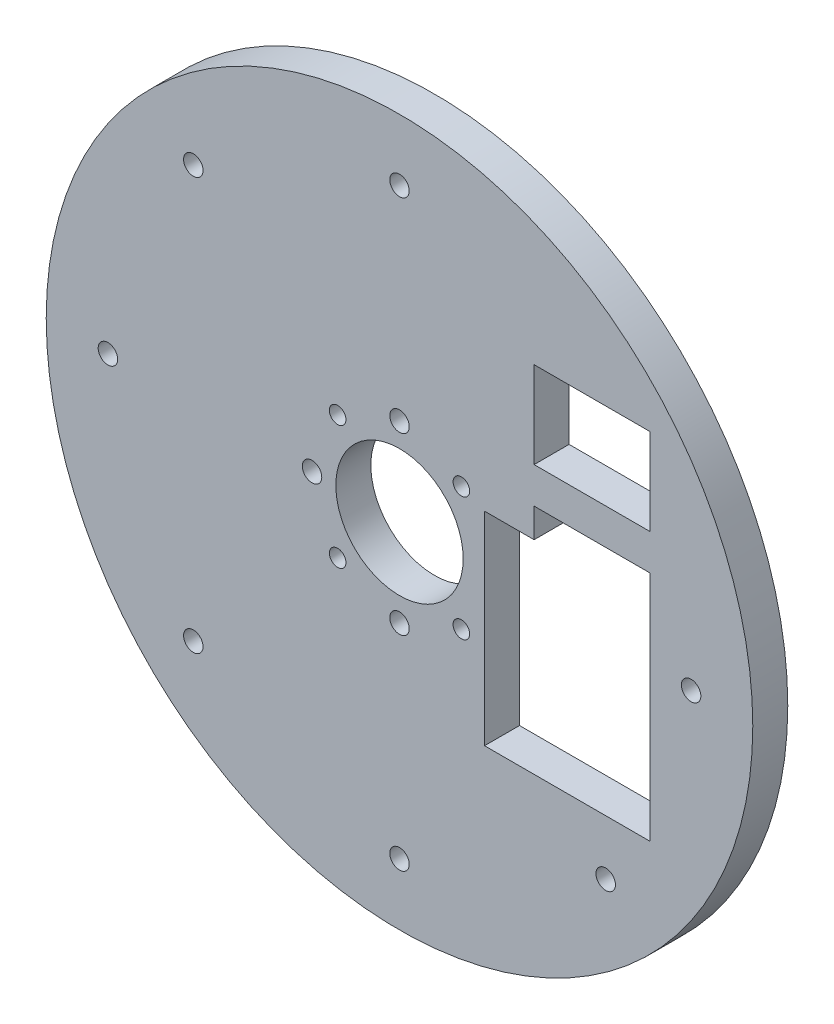
ISO-10303-21;
HEADER;
FILE_DESCRIPTION(('STEP AP214'),'2;1');
FILE_NAME('part.step','',(''),(''),'','','');
FILE_SCHEMA(('AUTOMOTIVE_DESIGN { 1 0 10303 214 1 1 1 1 }'));
ENDSEC;
DATA;
#1=APPLICATION_CONTEXT('core data for automotive mechanical design processes');
#2=APPLICATION_PROTOCOL_DEFINITION('international standard','automotive_design',2000,#1);
#3=PRODUCT_CONTEXT('',#1,'mechanical');
#4=PRODUCT('Part','Part','',(#3));
#5=PRODUCT_RELATED_PRODUCT_CATEGORY('part','',(#4));
#6=PRODUCT_DEFINITION_FORMATION('','',#4);
#7=PRODUCT_DEFINITION_CONTEXT('part definition',#1,'design');
#8=PRODUCT_DEFINITION('design','',#6,#7);
#9=PRODUCT_DEFINITION_SHAPE('','',#8);
#10=(LENGTH_UNIT() NAMED_UNIT(*) SI_UNIT(.MILLI.,.METRE.));
#11=(NAMED_UNIT(*) PLANE_ANGLE_UNIT() SI_UNIT($,.RADIAN.));
#12=(NAMED_UNIT(*) SI_UNIT($,.STERADIAN.) SOLID_ANGLE_UNIT());
#13=UNCERTAINTY_MEASURE_WITH_UNIT(LENGTH_MEASURE(1.E-05),#10,'distance_accuracy_value','');
#14=(GEOMETRIC_REPRESENTATION_CONTEXT(3) GLOBAL_UNCERTAINTY_ASSIGNED_CONTEXT((#13)) GLOBAL_UNIT_ASSIGNED_CONTEXT((#10,
#11,#12)) REPRESENTATION_CONTEXT('',''));
#15=CARTESIAN_POINT('',(0.,0.,0.));
#16=DIRECTION('',(0.,0.,1.));
#17=DIRECTION('',(1.,0.,0.));
#18=AXIS2_PLACEMENT_3D('',#15,#16,#17);
#19=CARTESIAN_POINT('',(0.,0.,6.));
#20=DIRECTION('',(0.,0.,1.));
#21=DIRECTION('',(1.,0.,0.));
#22=AXIS2_PLACEMENT_3D('',#19,#20,#21);
#23=PLANE('',#22);
#24=DIRECTION('',(0.,-1.,0.));
#25=VECTOR('',#24,1.);
#26=CARTESIAN_POINT('',(23.08,0.,6.));
#27=LINE('',#26,#25);
#28=CARTESIAN_POINT('',(23.08,13.92,6.));
#29=VERTEX_POINT('',#28);
#30=CARTESIAN_POINT('',(23.08,8.92,6.));
#31=VERTEX_POINT('',#30);
#32=EDGE_CURVE('E52',#29,#31,#27,.T.);
#33=ORIENTED_EDGE('',*,*,#32,.F.);
#34=DIRECTION('',(-1.,0.,0.));
#35=VECTOR('',#34,1.);
#36=CARTESIAN_POINT('',(0.,13.92,6.));
#37=LINE('',#36,#35);
#38=CARTESIAN_POINT('',(42.92,13.92,6.));
#39=VERTEX_POINT('',#38);
#40=EDGE_CURVE('E166',#39,#29,#37,.T.);
#41=ORIENTED_EDGE('',*,*,#40,.F.);
#42=DIRECTION('',(0.,1.,0.));
#43=VECTOR('',#42,1.);
#44=CARTESIAN_POINT('',(42.92,0.,6.));
#45=LINE('',#44,#43);
#46=CARTESIAN_POINT('',(42.92,-25.92,6.));
#47=VERTEX_POINT('',#46);
#48=EDGE_CURVE('E169',#47,#39,#45,.T.);
#49=ORIENTED_EDGE('',*,*,#48,.F.);
#50=DIRECTION('',(1.,0.,0.));
#51=VECTOR('',#50,1.);
#52=CARTESIAN_POINT('',(0.,-25.92,6.));
#53=LINE('',#52,#51);
#54=CARTESIAN_POINT('',(14.58,-25.92,6.));
#55=VERTEX_POINT('',#54);
#56=EDGE_CURVE('E172',#55,#47,#53,.T.);
#57=ORIENTED_EDGE('',*,*,#56,.F.);
#58=DIRECTION('',(0.,-1.,0.));
#59=VECTOR('',#58,1.);
#60=CARTESIAN_POINT('',(14.58,0.,6.));
#61=LINE('',#60,#59);
#62=CARTESIAN_POINT('',(14.58,8.92,6.));
#63=VERTEX_POINT('',#62);
#64=EDGE_CURVE('E164',#63,#55,#61,.T.);
#65=ORIENTED_EDGE('',*,*,#64,.F.);
#66=DIRECTION('',(-1.,0.,0.));
#67=VECTOR('',#66,1.);
#68=CARTESIAN_POINT('',(0.,8.92,6.));
#69=LINE('',#68,#67);
#70=EDGE_CURVE('E161',#31,#63,#69,.T.);
#71=ORIENTED_EDGE('',*,*,#70,.F.);
#72=EDGE_LOOP('',(#33,#41,#49,#57,#65,#71));
#73=FACE_BOUND('',#72,.T.);
#74=DIRECTION('',(0.,-1.,0.));
#75=VECTOR('',#74,1.);
#76=CARTESIAN_POINT('',(23.08,0.,6.));
#77=LINE('',#76,#75);
#78=CARTESIAN_POINT('',(23.08,34.92,6.));
#79=VERTEX_POINT('',#78);
#80=CARTESIAN_POINT('',(23.08,20.08,6.));
#81=VERTEX_POINT('',#80);
#82=EDGE_CURVE('E160',#79,#81,#77,.T.);
#83=ORIENTED_EDGE('',*,*,#82,.F.);
#84=DIRECTION('',(-1.,0.,0.));
#85=VECTOR('',#84,1.);
#86=CARTESIAN_POINT('',(0.,34.92,6.));
#87=LINE('',#86,#85);
#88=CARTESIAN_POINT('',(42.92,34.92,6.));
#89=VERTEX_POINT('',#88);
#90=EDGE_CURVE('E125',#89,#79,#87,.T.);
#91=ORIENTED_EDGE('',*,*,#90,.F.);
#92=DIRECTION('',(0.,1.,0.));
#93=VECTOR('',#92,1.);
#94=CARTESIAN_POINT('',(42.92,0.,6.));
#95=LINE('',#94,#93);
#96=CARTESIAN_POINT('',(42.92,20.08,6.));
#97=VERTEX_POINT('',#96);
#98=EDGE_CURVE('E358',#97,#89,#95,.T.);
#99=ORIENTED_EDGE('',*,*,#98,.F.);
#100=DIRECTION('',(1.,0.,0.));
#101=VECTOR('',#100,1.);
#102=CARTESIAN_POINT('',(0.,20.08,6.));
#103=LINE('',#102,#101);
#104=EDGE_CURVE('E360',#81,#97,#103,.T.);
#105=ORIENTED_EDGE('',*,*,#104,.F.);
#106=EDGE_LOOP('',(#83,#91,#99,#105));
#107=FACE_BOUND('',#106,.T.);
#108=CARTESIAN_POINT('',(50.,0.,6.));
#109=DIRECTION('',(0.,0.,1.));
#110=DIRECTION('',(1.,0.,0.));
#111=AXIS2_PLACEMENT_3D('',#108,#109,#110);
#112=CIRCLE('',#111,1.67);
#113=CARTESIAN_POINT('',(51.67,0.,6.));
#114=VERTEX_POINT('',#113);
#115=EDGE_CURVE('E199',#114,#114,#112,.T.);
#116=ORIENTED_EDGE('',*,*,#115,.F.);
#117=EDGE_LOOP('',(#116));
#118=FACE_BOUND('',#117,.T.);
#119=CARTESIAN_POINT('',(-35.3553390593274,35.3553390593274,6.));
#120=DIRECTION('',(0.,0.,1.));
#121=DIRECTION('',(1.,0.,0.));
#122=AXIS2_PLACEMENT_3D('',#119,#120,#121);
#123=CIRCLE('',#122,1.67);
#124=CARTESIAN_POINT('',(-33.6853390593274,35.3553390593274,6.));
#125=VERTEX_POINT('',#124);
#126=EDGE_CURVE('E211',#125,#125,#123,.T.);
#127=ORIENTED_EDGE('',*,*,#126,.F.);
#128=EDGE_LOOP('',(#127));
#129=FACE_BOUND('',#128,.T.);
#130=CARTESIAN_POINT('',(-35.3553390593274,-35.3553390593274,6.));
#131=DIRECTION('',(0.,0.,1.));
#132=DIRECTION('',(1.,0.,0.));
#133=AXIS2_PLACEMENT_3D('',#130,#131,#132);
#134=CIRCLE('',#133,1.67);
#135=CARTESIAN_POINT('',(-33.6853390593274,-35.3553390593274,6.));
#136=VERTEX_POINT('',#135);
#137=EDGE_CURVE('E223',#136,#136,#134,.T.);
#138=ORIENTED_EDGE('',*,*,#137,.F.);
#139=EDGE_LOOP('',(#138));
#140=FACE_BOUND('',#139,.T.);
#141=CARTESIAN_POINT('',(-10.6066017177982,10.6066017177983,6.));
#142=DIRECTION('',(0.,0.,1.));
#143=DIRECTION('',(1.,0.,0.));
#144=AXIS2_PLACEMENT_3D('',#141,#142,#143);
#145=CIRCLE('',#144,1.42);
#146=CARTESIAN_POINT('',(-9.18660171779816,10.6066017177983,6.));
#147=VERTEX_POINT('',#146);
#148=EDGE_CURVE('E235',#147,#147,#145,.T.);
#149=ORIENTED_EDGE('',*,*,#148,.F.);
#150=EDGE_LOOP('',(#149));
#151=FACE_BOUND('',#150,.T.);
#152=CARTESIAN_POINT('',(-10.6066017177982,-10.6066017177982,6.));
#153=DIRECTION('',(0.,0.,1.));
#154=DIRECTION('',(1.,0.,0.));
#155=AXIS2_PLACEMENT_3D('',#152,#153,#154);
#156=CIRCLE('',#155,1.42);
#157=CARTESIAN_POINT('',(-9.18660171779823,-10.6066017177982,6.));
#158=VERTEX_POINT('',#157);
#159=EDGE_CURVE('E247',#158,#158,#156,.T.);
#160=ORIENTED_EDGE('',*,*,#159,.F.);
#161=EDGE_LOOP('',(#160));
#162=FACE_BOUND('',#161,.T.);
#163=CARTESIAN_POINT('',(0.,-50.,6.));
#164=DIRECTION('',(0.,0.,1.));
#165=DIRECTION('',(1.,0.,0.));
#166=AXIS2_PLACEMENT_3D('',#163,#164,#165);
#167=CIRCLE('',#166,1.67);
#168=CARTESIAN_POINT('',(1.67,-50.,6.));
#169=VERTEX_POINT('',#168);
#170=EDGE_CURVE('E259',#169,#169,#167,.T.);
#171=ORIENTED_EDGE('',*,*,#170,.F.);
#172=EDGE_LOOP('',(#171));
#173=FACE_BOUND('',#172,.T.);
#174=CARTESIAN_POINT('',(0.,-15.,6.));
#175=DIRECTION('',(0.,0.,1.));
#176=DIRECTION('',(1.,0.,0.));
#177=AXIS2_PLACEMENT_3D('',#174,#175,#176);
#178=CIRCLE('',#177,1.67);
#179=CARTESIAN_POINT('',(1.67,-15.,6.));
#180=VERTEX_POINT('',#179);
#181=EDGE_CURVE('E271',#180,#180,#178,.T.);
#182=ORIENTED_EDGE('',*,*,#181,.F.);
#183=EDGE_LOOP('',(#182));
#184=FACE_BOUND('',#183,.T.);
#185=CARTESIAN_POINT('',(0.,0.,6.));
#186=DIRECTION('',(0.,0.,1.));
#187=DIRECTION('',(1.,0.,0.));
#188=AXIS2_PLACEMENT_3D('',#185,#186,#187);
#189=CIRCLE('',#188,60.58);
#190=CARTESIAN_POINT('',(60.58,0.,6.));
#191=VERTEX_POINT('',#190);
#192=EDGE_CURVE('E12',#191,#191,#189,.T.);
#193=ORIENTED_EDGE('',*,*,#192,.T.);
#194=EDGE_LOOP('',(#193));
#195=FACE_BOUND('',#194,.T.);
#196=CARTESIAN_POINT('',(0.,0.,6.));
#197=DIRECTION('',(0.,0.,1.));
#198=DIRECTION('',(1.,0.,0.));
#199=AXIS2_PLACEMENT_3D('',#196,#197,#198);
#200=CIRCLE('',#199,10.92);
#201=CARTESIAN_POINT('',(10.92,0.,6.));
#202=VERTEX_POINT('',#201);
#203=EDGE_CURVE('E277',#202,#202,#200,.T.);
#204=ORIENTED_EDGE('',*,*,#203,.F.);
#205=EDGE_LOOP('',(#204));
#206=FACE_BOUND('',#205,.T.);
#207=CARTESIAN_POINT('',(10.6066017177982,-10.6066017177982,6.));
#208=DIRECTION('',(0.,0.,1.));
#209=DIRECTION('',(1.,0.,0.));
#210=AXIS2_PLACEMENT_3D('',#207,#208,#209);
#211=CIRCLE('',#210,1.42);
#212=CARTESIAN_POINT('',(12.0266017177982,-10.6066017177982,6.));
#213=VERTEX_POINT('',#212);
#214=EDGE_CURVE('E265',#213,#213,#211,.T.);
#215=ORIENTED_EDGE('',*,*,#214,.F.);
#216=EDGE_LOOP('',(#215));
#217=FACE_BOUND('',#216,.T.);
#218=CARTESIAN_POINT('',(-15.,0.,6.));
#219=DIRECTION('',(0.,0.,1.));
#220=DIRECTION('',(1.,0.,0.));
#221=AXIS2_PLACEMENT_3D('',#218,#219,#220);
#222=CIRCLE('',#221,1.67);
#223=CARTESIAN_POINT('',(-13.33,0.,6.));
#224=VERTEX_POINT('',#223);
#225=EDGE_CURVE('E253',#224,#224,#222,.T.);
#226=ORIENTED_EDGE('',*,*,#225,.F.);
#227=EDGE_LOOP('',(#226));
#228=FACE_BOUND('',#227,.T.);
#229=CARTESIAN_POINT('',(1.04744440165294E-13,15.,6.));
#230=DIRECTION('',(0.,0.,1.));
#231=DIRECTION('',(1.,0.,0.));
#232=AXIS2_PLACEMENT_3D('',#229,#230,#231);
#233=CIRCLE('',#232,1.67);
#234=CARTESIAN_POINT('',(1.6700000000001,15.,6.));
#235=VERTEX_POINT('',#234);
#236=EDGE_CURVE('E241',#235,#235,#233,.T.);
#237=ORIENTED_EDGE('',*,*,#236,.F.);
#238=EDGE_LOOP('',(#237));
#239=FACE_BOUND('',#238,.T.);
#240=CARTESIAN_POINT('',(10.6066017177983,10.6066017177981,6.));
#241=DIRECTION('',(0.,0.,1.));
#242=DIRECTION('',(1.,0.,0.));
#243=AXIS2_PLACEMENT_3D('',#240,#241,#242);
#244=CIRCLE('',#243,1.42);
#245=CARTESIAN_POINT('',(12.0266017177983,10.6066017177981,6.));
#246=VERTEX_POINT('',#245);
#247=EDGE_CURVE('E229',#246,#246,#244,.T.);
#248=ORIENTED_EDGE('',*,*,#247,.F.);
#249=EDGE_LOOP('',(#248));
#250=FACE_BOUND('',#249,.T.);
#251=CARTESIAN_POINT('',(-50.,0.,6.));
#252=DIRECTION('',(0.,0.,1.));
#253=DIRECTION('',(1.,0.,0.));
#254=AXIS2_PLACEMENT_3D('',#251,#252,#253);
#255=CIRCLE('',#254,1.67);
#256=CARTESIAN_POINT('',(-48.33,0.,6.));
#257=VERTEX_POINT('',#256);
#258=EDGE_CURVE('E217',#257,#257,#255,.T.);
#259=ORIENTED_EDGE('',*,*,#258,.F.);
#260=EDGE_LOOP('',(#259));
#261=FACE_BOUND('',#260,.T.);
#262=CARTESIAN_POINT('',(0.,50.,6.));
#263=DIRECTION('',(0.,0.,1.));
#264=DIRECTION('',(1.,0.,0.));
#265=AXIS2_PLACEMENT_3D('',#262,#263,#264);
#266=CIRCLE('',#265,1.67);
#267=CARTESIAN_POINT('',(1.66999999999998,50.,6.));
#268=VERTEX_POINT('',#267);
#269=EDGE_CURVE('E205',#268,#268,#266,.T.);
#270=ORIENTED_EDGE('',*,*,#269,.F.);
#271=EDGE_LOOP('',(#270));
#272=FACE_BOUND('',#271,.T.);
#273=CARTESIAN_POINT('',(35.3553390593274,-35.3553390593274,6.));
#274=DIRECTION('',(0.,0.,1.));
#275=DIRECTION('',(1.,0.,0.));
#276=AXIS2_PLACEMENT_3D('',#273,#274,#275);
#277=CIRCLE('',#276,1.67);
#278=CARTESIAN_POINT('',(37.0253390593274,-35.3553390593274,6.));
#279=VERTEX_POINT('',#278);
#280=EDGE_CURVE('E193',#279,#279,#277,.T.);
#281=ORIENTED_EDGE('',*,*,#280,.F.);
#282=EDGE_LOOP('',(#281));
#283=FACE_BOUND('',#282,.T.);
#284=ADVANCED_FACE('F33',(#73,#107,#118,#129,#140,#151,#162,#173,#184,#195,#206,#217,#228,#239,
#250,#261,#272,#283),#23,.T.);
#285=CARTESIAN_POINT('',(0.,0.,0.));
#286=DIRECTION('',(0.,0.,1.));
#287=DIRECTION('',(1.,0.,0.));
#288=AXIS2_PLACEMENT_3D('',#285,#286,#287);
#289=PLANE('',#288);
#290=DIRECTION('',(-1.,0.,0.));
#291=VECTOR('',#290,1.);
#292=CARTESIAN_POINT('',(0.,13.92,0.));
#293=LINE('',#292,#291);
#294=CARTESIAN_POINT('',(42.92,13.92,0.));
#295=VERTEX_POINT('',#294);
#296=CARTESIAN_POINT('',(23.08,13.92,0.));
#297=VERTEX_POINT('',#296);
#298=EDGE_CURVE('E153',#295,#297,#293,.T.);
#299=ORIENTED_EDGE('',*,*,#298,.T.);
#300=DIRECTION('',(0.,-1.,0.));
#301=VECTOR('',#300,1.);
#302=CARTESIAN_POINT('',(23.08,0.,0.));
#303=LINE('',#302,#301);
#304=CARTESIAN_POINT('',(23.08,8.92,0.));
#305=VERTEX_POINT('',#304);
#306=EDGE_CURVE('E168',#297,#305,#303,.T.);
#307=ORIENTED_EDGE('',*,*,#306,.T.);
#308=DIRECTION('',(-1.,0.,0.));
#309=VECTOR('',#308,1.);
#310=CARTESIAN_POINT('',(0.,8.92,0.));
#311=LINE('',#310,#309);
#312=CARTESIAN_POINT('',(14.58,8.92,0.));
#313=VERTEX_POINT('',#312);
#314=EDGE_CURVE('E177',#305,#313,#311,.T.);
#315=ORIENTED_EDGE('',*,*,#314,.T.);
#316=DIRECTION('',(0.,-1.,0.));
#317=VECTOR('',#316,1.);
#318=CARTESIAN_POINT('',(14.58,0.,0.));
#319=LINE('',#318,#317);
#320=CARTESIAN_POINT('',(14.58,-25.92,0.));
#321=VERTEX_POINT('',#320);
#322=EDGE_CURVE('E180',#313,#321,#319,.T.);
#323=ORIENTED_EDGE('',*,*,#322,.T.);
#324=DIRECTION('',(1.,0.,0.));
#325=VECTOR('',#324,1.);
#326=CARTESIAN_POINT('',(0.,-25.92,0.));
#327=LINE('',#326,#325);
#328=CARTESIAN_POINT('',(42.92,-25.92,0.));
#329=VERTEX_POINT('',#328);
#330=EDGE_CURVE('E183',#321,#329,#327,.T.);
#331=ORIENTED_EDGE('',*,*,#330,.T.);
#332=DIRECTION('',(0.,1.,0.));
#333=VECTOR('',#332,1.);
#334=CARTESIAN_POINT('',(42.92,0.,0.));
#335=LINE('',#334,#333);
#336=EDGE_CURVE('E186',#329,#295,#335,.T.);
#337=ORIENTED_EDGE('',*,*,#336,.T.);
#338=EDGE_LOOP('',(#299,#307,#315,#323,#331,#337));
#339=FACE_BOUND('',#338,.T.);
#340=DIRECTION('',(-1.,0.,0.));
#341=VECTOR('',#340,1.);
#342=CARTESIAN_POINT('',(0.,34.92,0.));
#343=LINE('',#342,#341);
#344=CARTESIAN_POINT('',(42.92,34.92,0.));
#345=VERTEX_POINT('',#344);
#346=CARTESIAN_POINT('',(23.08,34.92,0.));
#347=VERTEX_POINT('',#346);
#348=EDGE_CURVE('E122',#345,#347,#343,.T.);
#349=ORIENTED_EDGE('',*,*,#348,.T.);
#350=DIRECTION('',(0.,-1.,0.));
#351=VECTOR('',#350,1.);
#352=CARTESIAN_POINT('',(23.08,0.,0.));
#353=LINE('',#352,#351);
#354=CARTESIAN_POINT('',(23.08,20.08,0.));
#355=VERTEX_POINT('',#354);
#356=EDGE_CURVE('E131',#347,#355,#353,.T.);
#357=ORIENTED_EDGE('',*,*,#356,.T.);
#358=DIRECTION('',(1.,0.,0.));
#359=VECTOR('',#358,1.);
#360=CARTESIAN_POINT('',(0.,20.08,0.));
#361=LINE('',#360,#359);
#362=CARTESIAN_POINT('',(42.92,20.08,0.));
#363=VERTEX_POINT('',#362);
#364=EDGE_CURVE('E138',#355,#363,#361,.T.);
#365=ORIENTED_EDGE('',*,*,#364,.T.);
#366=DIRECTION('',(0.,1.,0.));
#367=VECTOR('',#366,1.);
#368=CARTESIAN_POINT('',(42.92,0.,0.));
#369=LINE('',#368,#367);
#370=EDGE_CURVE('E142',#363,#345,#369,.T.);
#371=ORIENTED_EDGE('',*,*,#370,.T.);
#372=EDGE_LOOP('',(#349,#357,#365,#371));
#373=FACE_BOUND('',#372,.T.);
#374=CARTESIAN_POINT('',(50.,0.,0.));
#375=DIRECTION('',(0.,0.,1.));
#376=DIRECTION('',(1.,0.,0.));
#377=AXIS2_PLACEMENT_3D('',#374,#375,#376);
#378=CIRCLE('',#377,1.67);
#379=CARTESIAN_POINT('',(51.67,0.,0.));
#380=VERTEX_POINT('',#379);
#381=EDGE_CURVE('E196',#380,#380,#378,.T.);
#382=ORIENTED_EDGE('',*,*,#381,.T.);
#383=EDGE_LOOP('',(#382));
#384=FACE_BOUND('',#383,.T.);
#385=CARTESIAN_POINT('',(-35.3553390593274,35.3553390593274,0.));
#386=DIRECTION('',(0.,0.,1.));
#387=DIRECTION('',(1.,0.,0.));
#388=AXIS2_PLACEMENT_3D('',#385,#386,#387);
#389=CIRCLE('',#388,1.67);
#390=CARTESIAN_POINT('',(-33.6853390593274,35.3553390593274,0.));
#391=VERTEX_POINT('',#390);
#392=EDGE_CURVE('E208',#391,#391,#389,.T.);
#393=ORIENTED_EDGE('',*,*,#392,.T.);
#394=EDGE_LOOP('',(#393));
#395=FACE_BOUND('',#394,.T.);
#396=CARTESIAN_POINT('',(-35.3553390593274,-35.3553390593274,0.));
#397=DIRECTION('',(0.,0.,1.));
#398=DIRECTION('',(1.,0.,0.));
#399=AXIS2_PLACEMENT_3D('',#396,#397,#398);
#400=CIRCLE('',#399,1.67);
#401=CARTESIAN_POINT('',(-33.6853390593274,-35.3553390593274,0.));
#402=VERTEX_POINT('',#401);
#403=EDGE_CURVE('E220',#402,#402,#400,.T.);
#404=ORIENTED_EDGE('',*,*,#403,.T.);
#405=EDGE_LOOP('',(#404));
#406=FACE_BOUND('',#405,.T.);
#407=CARTESIAN_POINT('',(-10.6066017177982,10.6066017177983,0.));
#408=DIRECTION('',(0.,0.,1.));
#409=DIRECTION('',(1.,0.,0.));
#410=AXIS2_PLACEMENT_3D('',#407,#408,#409);
#411=CIRCLE('',#410,1.42);
#412=CARTESIAN_POINT('',(-9.18660171779816,10.6066017177983,0.));
#413=VERTEX_POINT('',#412);
#414=EDGE_CURVE('E232',#413,#413,#411,.T.);
#415=ORIENTED_EDGE('',*,*,#414,.T.);
#416=EDGE_LOOP('',(#415));
#417=FACE_BOUND('',#416,.T.);
#418=CARTESIAN_POINT('',(-10.6066017177982,-10.6066017177982,0.));
#419=DIRECTION('',(0.,0.,1.));
#420=DIRECTION('',(1.,0.,0.));
#421=AXIS2_PLACEMENT_3D('',#418,#419,#420);
#422=CIRCLE('',#421,1.42);
#423=CARTESIAN_POINT('',(-9.18660171779823,-10.6066017177982,0.));
#424=VERTEX_POINT('',#423);
#425=EDGE_CURVE('E244',#424,#424,#422,.T.);
#426=ORIENTED_EDGE('',*,*,#425,.T.);
#427=EDGE_LOOP('',(#426));
#428=FACE_BOUND('',#427,.T.);
#429=CARTESIAN_POINT('',(0.,-50.,0.));
#430=DIRECTION('',(0.,0.,1.));
#431=DIRECTION('',(1.,0.,0.));
#432=AXIS2_PLACEMENT_3D('',#429,#430,#431);
#433=CIRCLE('',#432,1.67);
#434=CARTESIAN_POINT('',(1.67,-50.,0.));
#435=VERTEX_POINT('',#434);
#436=EDGE_CURVE('E256',#435,#435,#433,.T.);
#437=ORIENTED_EDGE('',*,*,#436,.T.);
#438=EDGE_LOOP('',(#437));
#439=FACE_BOUND('',#438,.T.);
#440=CARTESIAN_POINT('',(0.,-15.,0.));
#441=DIRECTION('',(0.,0.,1.));
#442=DIRECTION('',(1.,0.,0.));
#443=AXIS2_PLACEMENT_3D('',#440,#441,#442);
#444=CIRCLE('',#443,1.67);
#445=CARTESIAN_POINT('',(1.67,-15.,0.));
#446=VERTEX_POINT('',#445);
#447=EDGE_CURVE('E268',#446,#446,#444,.T.);
#448=ORIENTED_EDGE('',*,*,#447,.T.);
#449=EDGE_LOOP('',(#448));
#450=FACE_BOUND('',#449,.T.);
#451=CARTESIAN_POINT('',(0.,0.,0.));
#452=DIRECTION('',(0.,0.,1.));
#453=DIRECTION('',(1.,0.,0.));
#454=AXIS2_PLACEMENT_3D('',#451,#452,#453);
#455=CIRCLE('',#454,60.58);
#456=CARTESIAN_POINT('',(60.58,0.,0.));
#457=VERTEX_POINT('',#456);
#458=EDGE_CURVE('E43',#457,#457,#455,.T.);
#459=ORIENTED_EDGE('',*,*,#458,.F.);
#460=EDGE_LOOP('',(#459));
#461=FACE_BOUND('',#460,.T.);
#462=CARTESIAN_POINT('',(0.,0.,0.));
#463=DIRECTION('',(0.,0.,1.));
#464=DIRECTION('',(1.,0.,0.));
#465=AXIS2_PLACEMENT_3D('',#462,#463,#464);
#466=CIRCLE('',#465,10.92);
#467=CARTESIAN_POINT('',(10.92,0.,0.));
#468=VERTEX_POINT('',#467);
#469=EDGE_CURVE('E37',#468,#468,#466,.T.);
#470=ORIENTED_EDGE('',*,*,#469,.T.);
#471=EDGE_LOOP('',(#470));
#472=FACE_BOUND('',#471,.T.);
#473=CARTESIAN_POINT('',(10.6066017177982,-10.6066017177982,0.));
#474=DIRECTION('',(0.,0.,1.));
#475=DIRECTION('',(1.,0.,0.));
#476=AXIS2_PLACEMENT_3D('',#473,#474,#475);
#477=CIRCLE('',#476,1.42);
#478=CARTESIAN_POINT('',(12.0266017177982,-10.6066017177982,0.));
#479=VERTEX_POINT('',#478);
#480=EDGE_CURVE('E262',#479,#479,#477,.T.);
#481=ORIENTED_EDGE('',*,*,#480,.T.);
#482=EDGE_LOOP('',(#481));
#483=FACE_BOUND('',#482,.T.);
#484=CARTESIAN_POINT('',(-15.,0.,0.));
#485=DIRECTION('',(0.,0.,1.));
#486=DIRECTION('',(1.,0.,0.));
#487=AXIS2_PLACEMENT_3D('',#484,#485,#486);
#488=CIRCLE('',#487,1.67);
#489=CARTESIAN_POINT('',(-13.33,0.,0.));
#490=VERTEX_POINT('',#489);
#491=EDGE_CURVE('E250',#490,#490,#488,.T.);
#492=ORIENTED_EDGE('',*,*,#491,.T.);
#493=EDGE_LOOP('',(#492));
#494=FACE_BOUND('',#493,.T.);
#495=CARTESIAN_POINT('',(1.04744440165294E-13,15.,0.));
#496=DIRECTION('',(0.,0.,1.));
#497=DIRECTION('',(1.,0.,0.));
#498=AXIS2_PLACEMENT_3D('',#495,#496,#497);
#499=CIRCLE('',#498,1.67);
#500=CARTESIAN_POINT('',(1.6700000000001,15.,0.));
#501=VERTEX_POINT('',#500);
#502=EDGE_CURVE('E238',#501,#501,#499,.T.);
#503=ORIENTED_EDGE('',*,*,#502,.T.);
#504=EDGE_LOOP('',(#503));
#505=FACE_BOUND('',#504,.T.);
#506=CARTESIAN_POINT('',(10.6066017177983,10.6066017177981,0.));
#507=DIRECTION('',(0.,0.,1.));
#508=DIRECTION('',(1.,0.,0.));
#509=AXIS2_PLACEMENT_3D('',#506,#507,#508);
#510=CIRCLE('',#509,1.42);
#511=CARTESIAN_POINT('',(12.0266017177983,10.6066017177981,0.));
#512=VERTEX_POINT('',#511);
#513=EDGE_CURVE('E226',#512,#512,#510,.T.);
#514=ORIENTED_EDGE('',*,*,#513,.T.);
#515=EDGE_LOOP('',(#514));
#516=FACE_BOUND('',#515,.T.);
#517=CARTESIAN_POINT('',(-50.,0.,0.));
#518=DIRECTION('',(0.,0.,1.));
#519=DIRECTION('',(1.,0.,0.));
#520=AXIS2_PLACEMENT_3D('',#517,#518,#519);
#521=CIRCLE('',#520,1.67);
#522=CARTESIAN_POINT('',(-48.33,0.,0.));
#523=VERTEX_POINT('',#522);
#524=EDGE_CURVE('E214',#523,#523,#521,.T.);
#525=ORIENTED_EDGE('',*,*,#524,.T.);
#526=EDGE_LOOP('',(#525));
#527=FACE_BOUND('',#526,.T.);
#528=CARTESIAN_POINT('',(0.,50.,0.));
#529=DIRECTION('',(0.,0.,1.));
#530=DIRECTION('',(1.,0.,0.));
#531=AXIS2_PLACEMENT_3D('',#528,#529,#530);
#532=CIRCLE('',#531,1.67);
#533=CARTESIAN_POINT('',(1.66999999999998,50.,0.));
#534=VERTEX_POINT('',#533);
#535=EDGE_CURVE('E202',#534,#534,#532,.T.);
#536=ORIENTED_EDGE('',*,*,#535,.T.);
#537=EDGE_LOOP('',(#536));
#538=FACE_BOUND('',#537,.T.);
#539=CARTESIAN_POINT('',(35.3553390593274,-35.3553390593274,0.));
#540=DIRECTION('',(0.,0.,1.));
#541=DIRECTION('',(1.,0.,0.));
#542=AXIS2_PLACEMENT_3D('',#539,#540,#541);
#543=CIRCLE('',#542,1.67);
#544=CARTESIAN_POINT('',(37.0253390593274,-35.3553390593274,0.));
#545=VERTEX_POINT('',#544);
#546=EDGE_CURVE('E128',#545,#545,#543,.T.);
#547=ORIENTED_EDGE('',*,*,#546,.T.);
#548=EDGE_LOOP('',(#547));
#549=FACE_BOUND('',#548,.T.);
#550=ADVANCED_FACE('F140',(#339,#373,#384,#395,#406,#417,#428,#439,#450,#461,#472,#483,#494,
#505,#516,#527,#538,#549),#289,.F.);
#551=CARTESIAN_POINT('',(0.,0.,6.));
#552=DIRECTION('',(0.,0.,-1.));
#553=DIRECTION('',(-1.,0.,0.));
#554=AXIS2_PLACEMENT_3D('',#551,#552,#553);
#555=CYLINDRICAL_SURFACE('',#554,60.58);
#556=ORIENTED_EDGE('',*,*,#192,.F.);
#557=EDGE_LOOP('',(#556));
#558=FACE_BOUND('',#557,.T.);
#559=ORIENTED_EDGE('',*,*,#458,.T.);
#560=EDGE_LOOP('',(#559));
#561=FACE_BOUND('',#560,.T.);
#562=ADVANCED_FACE('F289',(#558,#561),#555,.T.);
#563=CARTESIAN_POINT('',(0.,0.,6.));
#564=DIRECTION('',(0.,0.,-1.));
#565=DIRECTION('',(-1.,0.,0.));
#566=AXIS2_PLACEMENT_3D('',#563,#564,#565);
#567=CYLINDRICAL_SURFACE('',#566,10.92);
#568=ORIENTED_EDGE('',*,*,#203,.T.);
#569=EDGE_LOOP('',(#568));
#570=FACE_BOUND('',#569,.T.);
#571=ORIENTED_EDGE('',*,*,#469,.F.);
#572=EDGE_LOOP('',(#571));
#573=FACE_BOUND('',#572,.T.);
#574=ADVANCED_FACE('F286',(#570,#573),#567,.F.);
#575=CARTESIAN_POINT('',(0.,-15.,6.));
#576=DIRECTION('',(0.,0.,-1.));
#577=DIRECTION('',(-1.,0.,0.));
#578=AXIS2_PLACEMENT_3D('',#575,#576,#577);
#579=CYLINDRICAL_SURFACE('',#578,1.67);
#580=ORIENTED_EDGE('',*,*,#181,.T.);
#581=EDGE_LOOP('',(#580));
#582=FACE_BOUND('',#581,.T.);
#583=ORIENTED_EDGE('',*,*,#447,.F.);
#584=EDGE_LOOP('',(#583));
#585=FACE_BOUND('',#584,.T.);
#586=ADVANCED_FACE('F288',(#582,#585),#579,.F.);
#587=CARTESIAN_POINT('',(10.6066017177982,-10.6066017177982,6.));
#588=DIRECTION('',(0.,0.,-1.));
#589=DIRECTION('',(-1.,0.,0.));
#590=AXIS2_PLACEMENT_3D('',#587,#588,#589);
#591=CYLINDRICAL_SURFACE('',#590,1.42);
#592=ORIENTED_EDGE('',*,*,#214,.T.);
#593=EDGE_LOOP('',(#592));
#594=FACE_BOUND('',#593,.T.);
#595=ORIENTED_EDGE('',*,*,#480,.F.);
#596=EDGE_LOOP('',(#595));
#597=FACE_BOUND('',#596,.T.);
#598=ADVANCED_FACE('F295',(#594,#597),#591,.F.);
#599=CARTESIAN_POINT('',(0.,-50.,6.));
#600=DIRECTION('',(0.,0.,-1.));
#601=DIRECTION('',(-1.,0.,0.));
#602=AXIS2_PLACEMENT_3D('',#599,#600,#601);
#603=CYLINDRICAL_SURFACE('',#602,1.67);
#604=ORIENTED_EDGE('',*,*,#170,.T.);
#605=EDGE_LOOP('',(#604));
#606=FACE_BOUND('',#605,.T.);
#607=ORIENTED_EDGE('',*,*,#436,.F.);
#608=EDGE_LOOP('',(#607));
#609=FACE_BOUND('',#608,.T.);
#610=ADVANCED_FACE('F439',(#606,#609),#603,.F.);
#611=CARTESIAN_POINT('',(-15.,0.,6.));
#612=DIRECTION('',(0.,0.,-1.));
#613=DIRECTION('',(-1.,0.,0.));
#614=AXIS2_PLACEMENT_3D('',#611,#612,#613);
#615=CYLINDRICAL_SURFACE('',#614,1.67);
#616=ORIENTED_EDGE('',*,*,#225,.T.);
#617=EDGE_LOOP('',(#616));
#618=FACE_BOUND('',#617,.T.);
#619=ORIENTED_EDGE('',*,*,#491,.F.);
#620=EDGE_LOOP('',(#619));
#621=FACE_BOUND('',#620,.T.);
#622=ADVANCED_FACE('F435',(#618,#621),#615,.F.);
#623=CARTESIAN_POINT('',(-10.6066017177982,-10.6066017177982,6.));
#624=DIRECTION('',(0.,0.,-1.));
#625=DIRECTION('',(-1.,0.,0.));
#626=AXIS2_PLACEMENT_3D('',#623,#624,#625);
#627=CYLINDRICAL_SURFACE('',#626,1.42);
#628=ORIENTED_EDGE('',*,*,#159,.T.);
#629=EDGE_LOOP('',(#628));
#630=FACE_BOUND('',#629,.T.);
#631=ORIENTED_EDGE('',*,*,#425,.F.);
#632=EDGE_LOOP('',(#631));
#633=FACE_BOUND('',#632,.T.);
#634=ADVANCED_FACE('F431',(#630,#633),#627,.F.);
#635=CARTESIAN_POINT('',(1.04744440165294E-13,15.,6.));
#636=DIRECTION('',(0.,0.,-1.));
#637=DIRECTION('',(-1.,0.,0.));
#638=AXIS2_PLACEMENT_3D('',#635,#636,#637);
#639=CYLINDRICAL_SURFACE('',#638,1.67);
#640=ORIENTED_EDGE('',*,*,#236,.T.);
#641=EDGE_LOOP('',(#640));
#642=FACE_BOUND('',#641,.T.);
#643=ORIENTED_EDGE('',*,*,#502,.F.);
#644=EDGE_LOOP('',(#643));
#645=FACE_BOUND('',#644,.T.);
#646=ADVANCED_FACE('F427',(#642,#645),#639,.F.);
#647=CARTESIAN_POINT('',(-10.6066017177982,10.6066017177983,6.));
#648=DIRECTION('',(0.,0.,-1.));
#649=DIRECTION('',(-1.,0.,0.));
#650=AXIS2_PLACEMENT_3D('',#647,#648,#649);
#651=CYLINDRICAL_SURFACE('',#650,1.42);
#652=ORIENTED_EDGE('',*,*,#148,.T.);
#653=EDGE_LOOP('',(#652));
#654=FACE_BOUND('',#653,.T.);
#655=ORIENTED_EDGE('',*,*,#414,.F.);
#656=EDGE_LOOP('',(#655));
#657=FACE_BOUND('',#656,.T.);
#658=ADVANCED_FACE('F423',(#654,#657),#651,.F.);
#659=CARTESIAN_POINT('',(10.6066017177983,10.6066017177981,6.));
#660=DIRECTION('',(0.,0.,-1.));
#661=DIRECTION('',(-1.,0.,0.));
#662=AXIS2_PLACEMENT_3D('',#659,#660,#661);
#663=CYLINDRICAL_SURFACE('',#662,1.42);
#664=ORIENTED_EDGE('',*,*,#247,.T.);
#665=EDGE_LOOP('',(#664));
#666=FACE_BOUND('',#665,.T.);
#667=ORIENTED_EDGE('',*,*,#513,.F.);
#668=EDGE_LOOP('',(#667));
#669=FACE_BOUND('',#668,.T.);
#670=ADVANCED_FACE('F419',(#666,#669),#663,.F.);
#671=CARTESIAN_POINT('',(-35.3553390593274,-35.3553390593274,6.));
#672=DIRECTION('',(0.,0.,-1.));
#673=DIRECTION('',(-1.,0.,0.));
#674=AXIS2_PLACEMENT_3D('',#671,#672,#673);
#675=CYLINDRICAL_SURFACE('',#674,1.67);
#676=ORIENTED_EDGE('',*,*,#137,.T.);
#677=EDGE_LOOP('',(#676));
#678=FACE_BOUND('',#677,.T.);
#679=ORIENTED_EDGE('',*,*,#403,.F.);
#680=EDGE_LOOP('',(#679));
#681=FACE_BOUND('',#680,.T.);
#682=ADVANCED_FACE('F415',(#678,#681),#675,.F.);
#683=CARTESIAN_POINT('',(-50.,0.,6.));
#684=DIRECTION('',(0.,0.,-1.));
#685=DIRECTION('',(-1.,0.,0.));
#686=AXIS2_PLACEMENT_3D('',#683,#684,#685);
#687=CYLINDRICAL_SURFACE('',#686,1.67);
#688=ORIENTED_EDGE('',*,*,#258,.T.);
#689=EDGE_LOOP('',(#688));
#690=FACE_BOUND('',#689,.T.);
#691=ORIENTED_EDGE('',*,*,#524,.F.);
#692=EDGE_LOOP('',(#691));
#693=FACE_BOUND('',#692,.T.);
#694=ADVANCED_FACE('F409',(#690,#693),#687,.F.);
#695=CARTESIAN_POINT('',(-35.3553390593274,35.3553390593274,6.));
#696=DIRECTION('',(0.,0.,-1.));
#697=DIRECTION('',(-1.,0.,0.));
#698=AXIS2_PLACEMENT_3D('',#695,#696,#697);
#699=CYLINDRICAL_SURFACE('',#698,1.67);
#700=ORIENTED_EDGE('',*,*,#126,.T.);
#701=EDGE_LOOP('',(#700));
#702=FACE_BOUND('',#701,.T.);
#703=ORIENTED_EDGE('',*,*,#392,.F.);
#704=EDGE_LOOP('',(#703));
#705=FACE_BOUND('',#704,.T.);
#706=ADVANCED_FACE('F401',(#702,#705),#699,.F.);
#707=CARTESIAN_POINT('',(0.,50.,6.));
#708=DIRECTION('',(0.,0.,-1.));
#709=DIRECTION('',(-1.,0.,0.));
#710=AXIS2_PLACEMENT_3D('',#707,#708,#709);
#711=CYLINDRICAL_SURFACE('',#710,1.67);
#712=ORIENTED_EDGE('',*,*,#269,.T.);
#713=EDGE_LOOP('',(#712));
#714=FACE_BOUND('',#713,.T.);
#715=ORIENTED_EDGE('',*,*,#535,.F.);
#716=EDGE_LOOP('',(#715));
#717=FACE_BOUND('',#716,.T.);
#718=ADVANCED_FACE('F323',(#714,#717),#711,.F.);
#719=CARTESIAN_POINT('',(50.,0.,6.));
#720=DIRECTION('',(0.,0.,-1.));
#721=DIRECTION('',(-1.,0.,0.));
#722=AXIS2_PLACEMENT_3D('',#719,#720,#721);
#723=CYLINDRICAL_SURFACE('',#722,1.67);
#724=ORIENTED_EDGE('',*,*,#115,.T.);
#725=EDGE_LOOP('',(#724));
#726=FACE_BOUND('',#725,.T.);
#727=ORIENTED_EDGE('',*,*,#381,.F.);
#728=EDGE_LOOP('',(#727));
#729=FACE_BOUND('',#728,.T.);
#730=ADVANCED_FACE('F317',(#726,#729),#723,.F.);
#731=CARTESIAN_POINT('',(35.3553390593274,-35.3553390593274,6.));
#732=DIRECTION('',(0.,0.,-1.));
#733=DIRECTION('',(-1.,0.,0.));
#734=AXIS2_PLACEMENT_3D('',#731,#732,#733);
#735=CYLINDRICAL_SURFACE('',#734,1.67);
#736=ORIENTED_EDGE('',*,*,#280,.T.);
#737=EDGE_LOOP('',(#736));
#738=FACE_BOUND('',#737,.T.);
#739=ORIENTED_EDGE('',*,*,#546,.F.);
#740=EDGE_LOOP('',(#739));
#741=FACE_BOUND('',#740,.T.);
#742=ADVANCED_FACE('F311',(#738,#741),#735,.F.);
#743=CARTESIAN_POINT('',(23.08,20.,0.));
#744=DIRECTION('',(-1.,0.,0.));
#745=DIRECTION('',(0.,0.,1.));
#746=AXIS2_PLACEMENT_3D('',#743,#744,#745);
#747=PLANE('',#746);
#748=ORIENTED_EDGE('',*,*,#82,.T.);
#749=DIRECTION('',(0.,0.,1.));
#750=VECTOR('',#749,1.);
#751=CARTESIAN_POINT('',(23.08,20.08,0.));
#752=LINE('',#751,#750);
#753=EDGE_CURVE('E134',#355,#81,#752,.T.);
#754=ORIENTED_EDGE('',*,*,#753,.F.);
#755=ORIENTED_EDGE('',*,*,#356,.F.);
#756=DIRECTION('',(0.,0.,1.));
#757=VECTOR('',#756,1.);
#758=CARTESIAN_POINT('',(23.08,34.92,0.));
#759=LINE('',#758,#757);
#760=EDGE_CURVE('E119',#347,#79,#759,.T.);
#761=ORIENTED_EDGE('',*,*,#760,.T.);
#762=EDGE_LOOP('',(#748,#754,#755,#761));
#763=FACE_BOUND('',#762,.T.);
#764=ADVANCED_FACE('F132',(#763),#747,.F.);
#765=CARTESIAN_POINT('',(23.,34.92,0.));
#766=DIRECTION('',(0.,1.,0.));
#767=DIRECTION('',(0.,0.,1.));
#768=AXIS2_PLACEMENT_3D('',#765,#766,#767);
#769=PLANE('',#768);
#770=ORIENTED_EDGE('',*,*,#90,.T.);
#771=ORIENTED_EDGE('',*,*,#760,.F.);
#772=ORIENTED_EDGE('',*,*,#348,.F.);
#773=DIRECTION('',(0.,0.,1.));
#774=VECTOR('',#773,1.);
#775=CARTESIAN_POINT('',(42.92,34.92,0.));
#776=LINE('',#775,#774);
#777=EDGE_CURVE('E113',#345,#89,#776,.T.);
#778=ORIENTED_EDGE('',*,*,#777,.T.);
#779=EDGE_LOOP('',(#770,#771,#772,#778));
#780=FACE_BOUND('',#779,.T.);
#781=ADVANCED_FACE('F35',(#780),#769,.F.);
#782=CARTESIAN_POINT('',(42.92,20.,0.));
#783=DIRECTION('',(1.,0.,0.));
#784=DIRECTION('',(0.,0.,-1.));
#785=AXIS2_PLACEMENT_3D('',#782,#783,#784);
#786=PLANE('',#785);
#787=ORIENTED_EDGE('',*,*,#98,.T.);
#788=ORIENTED_EDGE('',*,*,#777,.F.);
#789=ORIENTED_EDGE('',*,*,#370,.F.);
#790=DIRECTION('',(0.,0.,1.));
#791=VECTOR('',#790,1.);
#792=CARTESIAN_POINT('',(42.92,20.08,0.));
#793=LINE('',#792,#791);
#794=EDGE_CURVE('E98',#363,#97,#793,.T.);
#795=ORIENTED_EDGE('',*,*,#794,.T.);
#796=EDGE_LOOP('',(#787,#788,#789,#795));
#797=FACE_BOUND('',#796,.T.);
#798=ADVANCED_FACE('F316',(#797),#786,.F.);
#799=CARTESIAN_POINT('',(23.,20.08,0.));
#800=DIRECTION('',(0.,-1.,0.));
#801=DIRECTION('',(0.,0.,-1.));
#802=AXIS2_PLACEMENT_3D('',#799,#800,#801);
#803=PLANE('',#802);
#804=ORIENTED_EDGE('',*,*,#104,.T.);
#805=ORIENTED_EDGE('',*,*,#794,.F.);
#806=ORIENTED_EDGE('',*,*,#364,.F.);
#807=ORIENTED_EDGE('',*,*,#753,.T.);
#808=EDGE_LOOP('',(#804,#805,#806,#807));
#809=FACE_BOUND('',#808,.T.);
#810=ADVANCED_FACE('F351',(#809),#803,.F.);
#811=CARTESIAN_POINT('',(23.08,9.00000000000001,0.));
#812=DIRECTION('',(-1.,0.,0.));
#813=DIRECTION('',(0.,0.,1.));
#814=AXIS2_PLACEMENT_3D('',#811,#812,#813);
#815=PLANE('',#814);
#816=ORIENTED_EDGE('',*,*,#32,.T.);
#817=DIRECTION('',(0.,0.,1.));
#818=VECTOR('',#817,1.);
#819=CARTESIAN_POINT('',(23.08,8.92,0.));
#820=LINE('',#819,#818);
#821=EDGE_CURVE('E151',#305,#31,#820,.T.);
#822=ORIENTED_EDGE('',*,*,#821,.F.);
#823=ORIENTED_EDGE('',*,*,#306,.F.);
#824=DIRECTION('',(0.,0.,1.));
#825=VECTOR('',#824,1.);
#826=CARTESIAN_POINT('',(23.08,13.92,0.));
#827=LINE('',#826,#825);
#828=EDGE_CURVE('E89',#297,#29,#827,.T.);
#829=ORIENTED_EDGE('',*,*,#828,.T.);
#830=EDGE_LOOP('',(#816,#822,#823,#829));
#831=FACE_BOUND('',#830,.T.);
#832=ADVANCED_FACE('F348',(#831),#815,.F.);
#833=CARTESIAN_POINT('',(23.,13.92,0.));
#834=DIRECTION('',(0.,1.,0.));
#835=DIRECTION('',(0.,0.,1.));
#836=AXIS2_PLACEMENT_3D('',#833,#834,#835);
#837=PLANE('',#836);
#838=ORIENTED_EDGE('',*,*,#40,.T.);
#839=ORIENTED_EDGE('',*,*,#828,.F.);
#840=ORIENTED_EDGE('',*,*,#298,.F.);
#841=DIRECTION('',(0.,0.,1.));
#842=VECTOR('',#841,1.);
#843=CARTESIAN_POINT('',(42.92,13.92,0.));
#844=LINE('',#843,#842);
#845=EDGE_CURVE('E157',#295,#39,#844,.T.);
#846=ORIENTED_EDGE('',*,*,#845,.T.);
#847=EDGE_LOOP('',(#838,#839,#840,#846));
#848=FACE_BOUND('',#847,.T.);
#849=ADVANCED_FACE('F344',(#848),#837,.F.);
#850=CARTESIAN_POINT('',(42.92,14.,0.));
#851=DIRECTION('',(1.,0.,0.));
#852=DIRECTION('',(0.,1.,0.));
#853=AXIS2_PLACEMENT_3D('',#850,#851,#852);
#854=PLANE('',#853);
#855=ORIENTED_EDGE('',*,*,#48,.T.);
#856=ORIENTED_EDGE('',*,*,#845,.F.);
#857=ORIENTED_EDGE('',*,*,#336,.F.);
#858=DIRECTION('',(0.,0.,1.));
#859=VECTOR('',#858,1.);
#860=CARTESIAN_POINT('',(42.92,-25.92,0.));
#861=LINE('',#860,#859);
#862=EDGE_CURVE('E155',#329,#47,#861,.T.);
#863=ORIENTED_EDGE('',*,*,#862,.T.);
#864=EDGE_LOOP('',(#855,#856,#857,#863));
#865=FACE_BOUND('',#864,.T.);
#866=ADVANCED_FACE('F340',(#865),#854,.F.);
#867=CARTESIAN_POINT('',(43.,-25.92,0.));
#868=DIRECTION('',(0.,-1.,0.));
#869=DIRECTION('',(1.,0.,0.));
#870=AXIS2_PLACEMENT_3D('',#867,#868,#869);
#871=PLANE('',#870);
#872=ORIENTED_EDGE('',*,*,#56,.T.);
#873=ORIENTED_EDGE('',*,*,#862,.F.);
#874=ORIENTED_EDGE('',*,*,#330,.F.);
#875=DIRECTION('',(0.,0.,1.));
#876=VECTOR('',#875,1.);
#877=CARTESIAN_POINT('',(14.58,-25.92,0.));
#878=LINE('',#877,#876);
#879=EDGE_CURVE('E150',#321,#55,#878,.T.);
#880=ORIENTED_EDGE('',*,*,#879,.T.);
#881=EDGE_LOOP('',(#872,#873,#874,#880));
#882=FACE_BOUND('',#881,.T.);
#883=ADVANCED_FACE('F336',(#882),#871,.F.);
#884=CARTESIAN_POINT('',(14.58,-26.,0.));
#885=DIRECTION('',(-1.,0.,0.));
#886=DIRECTION('',(0.,0.,1.));
#887=AXIS2_PLACEMENT_3D('',#884,#885,#886);
#888=PLANE('',#887);
#889=ORIENTED_EDGE('',*,*,#64,.T.);
#890=ORIENTED_EDGE('',*,*,#879,.F.);
#891=ORIENTED_EDGE('',*,*,#322,.F.);
#892=DIRECTION('',(0.,0.,1.));
#893=VECTOR('',#892,1.);
#894=CARTESIAN_POINT('',(14.58,8.92,0.));
#895=LINE('',#894,#893);
#896=EDGE_CURVE('E148',#313,#63,#895,.T.);
#897=ORIENTED_EDGE('',*,*,#896,.T.);
#898=EDGE_LOOP('',(#889,#890,#891,#897));
#899=FACE_BOUND('',#898,.T.);
#900=ADVANCED_FACE('F332',(#899),#888,.F.);
#901=CARTESIAN_POINT('',(14.5,8.92,0.));
#902=DIRECTION('',(0.,1.,0.));
#903=DIRECTION('',(0.,0.,1.));
#904=AXIS2_PLACEMENT_3D('',#901,#902,#903);
#905=PLANE('',#904);
#906=ORIENTED_EDGE('',*,*,#70,.T.);
#907=ORIENTED_EDGE('',*,*,#896,.F.);
#908=ORIENTED_EDGE('',*,*,#314,.F.);
#909=ORIENTED_EDGE('',*,*,#821,.T.);
#910=EDGE_LOOP('',(#906,#907,#908,#909));
#911=FACE_BOUND('',#910,.T.);
#912=ADVANCED_FACE('F329',(#911),#905,.F.);
#913=CLOSED_SHELL('',(#284,#550,#562,#574,#586,#598,#610,#622,#634,#646,#658,#670,#682,#694,
#706,#718,#730,#742,#764,#781,#798,#810,#832,#849,#866,#883,#900,#912));
#914=MANIFOLD_SOLID_BREP('B2',#913);
#915=ADVANCED_BREP_SHAPE_REPRESENTATION('',(#18,#914),#14);
#916=SHAPE_DEFINITION_REPRESENTATION(#9,#915);
ENDSEC;
END-ISO-10303-21;
